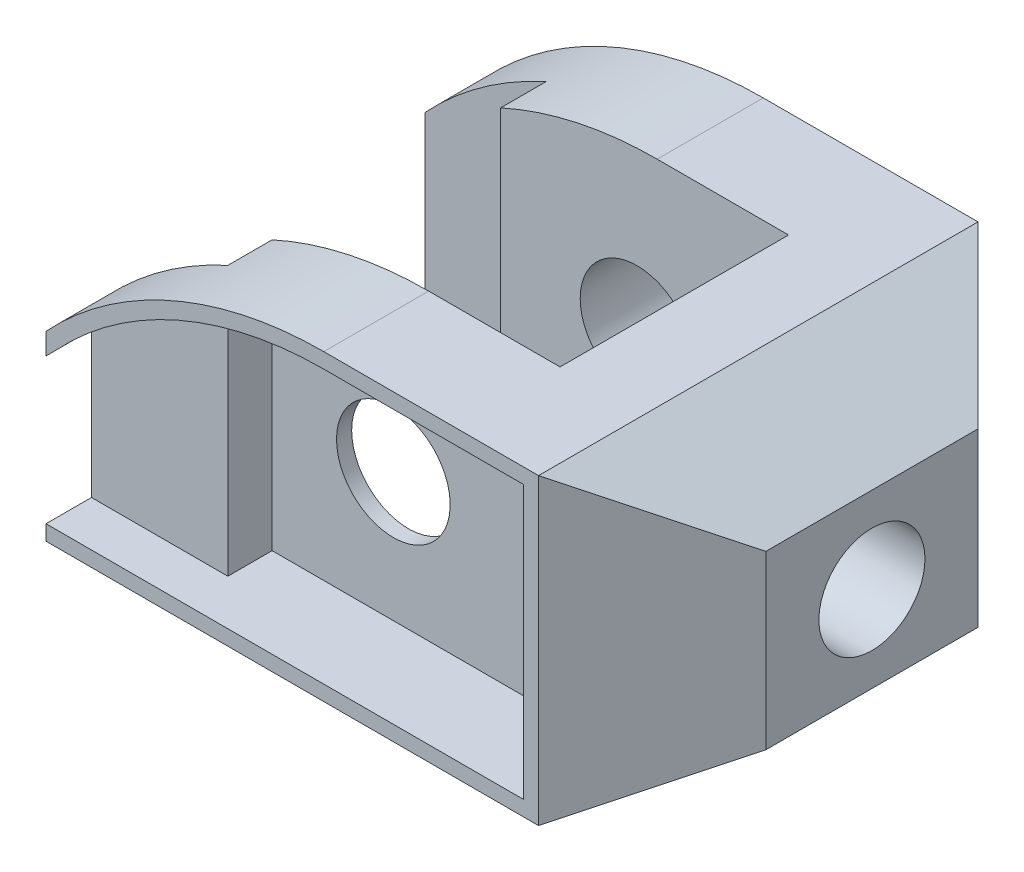
ISO-10303-21;
HEADER;
FILE_DESCRIPTION(('STEP AP214'),'2;1');
FILE_NAME('part.step','',(''),(''),'','','');
FILE_SCHEMA(('AUTOMOTIVE_DESIGN { 1 0 10303 214 1 1 1 1 }'));
ENDSEC;
DATA;
#1=APPLICATION_CONTEXT('core data for automotive mechanical design processes');
#2=APPLICATION_PROTOCOL_DEFINITION('international standard','automotive_design',2000,#1);
#3=PRODUCT_CONTEXT('',#1,'mechanical');
#4=PRODUCT('Part','Part','',(#3));
#5=PRODUCT_RELATED_PRODUCT_CATEGORY('part','',(#4));
#6=PRODUCT_DEFINITION_FORMATION('','',#4);
#7=PRODUCT_DEFINITION_CONTEXT('part definition',#1,'design');
#8=PRODUCT_DEFINITION('design','',#6,#7);
#9=PRODUCT_DEFINITION_SHAPE('','',#8);
#10=(LENGTH_UNIT() NAMED_UNIT(*) SI_UNIT(.MILLI.,.METRE.));
#11=(NAMED_UNIT(*) PLANE_ANGLE_UNIT() SI_UNIT($,.RADIAN.));
#12=(NAMED_UNIT(*) SI_UNIT($,.STERADIAN.) SOLID_ANGLE_UNIT());
#13=UNCERTAINTY_MEASURE_WITH_UNIT(LENGTH_MEASURE(1.E-05),#10,'distance_accuracy_value','');
#14=(GEOMETRIC_REPRESENTATION_CONTEXT(3) GLOBAL_UNCERTAINTY_ASSIGNED_CONTEXT((#13)) GLOBAL_UNIT_ASSIGNED_CONTEXT((#10,
#11,#12)) REPRESENTATION_CONTEXT('',''));
#15=CARTESIAN_POINT('',(0.,0.,0.));
#16=DIRECTION('',(0.,0.,1.));
#17=DIRECTION('',(1.,0.,0.));
#18=AXIS2_PLACEMENT_3D('',#15,#16,#17);
#19=CARTESIAN_POINT('',(34.,19.,58.));
#20=DIRECTION('',(0.,0.,-1.));
#21=DIRECTION('',(-1.,0.,0.));
#22=AXIS2_PLACEMENT_3D('',#19,#20,#21);
#23=CYLINDRICAL_SURFACE('',#22,7.5);
#24=CARTESIAN_POINT('',(34.,19.,44.1598243638916));
#25=DIRECTION('',(0.,0.,1.));
#26=DIRECTION('',(1.,0.,0.));
#27=AXIS2_PLACEMENT_3D('',#24,#25,#26);
#28=CIRCLE('',#27,7.5);
#29=CARTESIAN_POINT('',(26.5,19.,44.1598243638916));
#30=VERTEX_POINT('',#29);
#31=EDGE_CURVE('E318',#30,#30,#28,.T.);
#32=CARTESIAN_POINT('',(34.,19.,46.1598243638916));
#33=DIRECTION('',(0.,0.,1.));
#34=DIRECTION('',(1.,0.,0.));
#35=AXIS2_PLACEMENT_3D('',#32,#33,#34);
#36=CIRCLE('',#35,7.5);
#37=CARTESIAN_POINT('',(26.5,19.,46.1598243638916));
#38=VERTEX_POINT('',#37);
#39=EDGE_CURVE('E50',#38,#38,#36,.T.);
#40=CARTESIAN_POINT('',(26.5,19.,44.1598243638916));
#41=CARTESIAN_POINT('',(26.5,19.,44.180657697225));
#42=CARTESIAN_POINT('',(26.5,19.,44.2014910305583));
#43=CARTESIAN_POINT('',(26.5,19.,44.243157697225));
#44=CARTESIAN_POINT('',(26.5,19.,44.2639910305583));
#45=CARTESIAN_POINT('',(26.5,19.,44.305657697225));
#46=CARTESIAN_POINT('',(26.5,19.,44.3264910305583));
#47=CARTESIAN_POINT('',(26.5,19.,44.368157697225));
#48=CARTESIAN_POINT('',(26.5,19.,44.3889910305583));
#49=CARTESIAN_POINT('',(26.5,19.,44.430657697225));
#50=CARTESIAN_POINT('',(26.5,19.,44.4514910305583));
#51=CARTESIAN_POINT('',(26.5,19.,44.493157697225));
#52=CARTESIAN_POINT('',(26.5,19.,44.5139910305583));
#53=CARTESIAN_POINT('',(26.5,19.,44.555657697225));
#54=CARTESIAN_POINT('',(26.5,19.,44.5764910305583));
#55=CARTESIAN_POINT('',(26.5,19.,44.618157697225));
#56=CARTESIAN_POINT('',(26.5,19.,44.6389910305583));
#57=CARTESIAN_POINT('',(26.5,19.,44.680657697225));
#58=CARTESIAN_POINT('',(26.5,19.,44.7014910305583));
#59=CARTESIAN_POINT('',(26.5,19.,44.743157697225));
#60=CARTESIAN_POINT('',(26.5,19.,44.7639910305583));
#61=CARTESIAN_POINT('',(26.5,19.,44.805657697225));
#62=CARTESIAN_POINT('',(26.5,19.,44.8264910305583));
#63=CARTESIAN_POINT('',(26.5,19.,44.868157697225));
#64=CARTESIAN_POINT('',(26.5,19.,44.8889910305583));
#65=CARTESIAN_POINT('',(26.5,19.,44.930657697225));
#66=CARTESIAN_POINT('',(26.5,19.,44.9514910305583));
#67=CARTESIAN_POINT('',(26.5,19.,44.993157697225));
#68=CARTESIAN_POINT('',(26.5,19.,45.0139910305583));
#69=CARTESIAN_POINT('',(26.5,19.,45.055657697225));
#70=CARTESIAN_POINT('',(26.5,19.,45.0764910305583));
#71=CARTESIAN_POINT('',(26.5,19.,45.118157697225));
#72=CARTESIAN_POINT('',(26.5,19.,45.1389910305583));
#73=CARTESIAN_POINT('',(26.5,19.,45.180657697225));
#74=CARTESIAN_POINT('',(26.5,19.,45.2014910305583));
#75=CARTESIAN_POINT('',(26.5,19.,45.243157697225));
#76=CARTESIAN_POINT('',(26.5,19.,45.2639910305583));
#77=CARTESIAN_POINT('',(26.5,19.,45.305657697225));
#78=CARTESIAN_POINT('',(26.5,19.,45.3264910305583));
#79=CARTESIAN_POINT('',(26.5,19.,45.368157697225));
#80=CARTESIAN_POINT('',(26.5,19.,45.3889910305583));
#81=CARTESIAN_POINT('',(26.5,19.,45.430657697225));
#82=CARTESIAN_POINT('',(26.5,19.,45.4514910305583));
#83=CARTESIAN_POINT('',(26.5,19.,45.493157697225));
#84=CARTESIAN_POINT('',(26.5,19.,45.5139910305583));
#85=CARTESIAN_POINT('',(26.5,19.,45.555657697225));
#86=CARTESIAN_POINT('',(26.5,19.,45.5764910305583));
#87=CARTESIAN_POINT('',(26.5,19.,45.618157697225));
#88=CARTESIAN_POINT('',(26.5,19.,45.6389910305583));
#89=CARTESIAN_POINT('',(26.5,19.,45.680657697225));
#90=CARTESIAN_POINT('',(26.5,19.,45.7014910305583));
#91=CARTESIAN_POINT('',(26.5,19.,45.743157697225));
#92=CARTESIAN_POINT('',(26.5,19.,45.7639910305583));
#93=CARTESIAN_POINT('',(26.5,19.,45.805657697225));
#94=CARTESIAN_POINT('',(26.5,19.,45.8264910305583));
#95=CARTESIAN_POINT('',(26.5,19.,45.868157697225));
#96=CARTESIAN_POINT('',(26.5,19.,45.8889910305583));
#97=CARTESIAN_POINT('',(26.5,19.,45.930657697225));
#98=CARTESIAN_POINT('',(26.5,19.,45.9514910305583));
#99=CARTESIAN_POINT('',(26.5,19.,45.993157697225));
#100=CARTESIAN_POINT('',(26.5,19.,46.0139910305583));
#101=CARTESIAN_POINT('',(26.5,19.,46.055657697225));
#102=CARTESIAN_POINT('',(26.5,19.,46.0764910305583));
#103=CARTESIAN_POINT('',(26.5,19.,46.118157697225));
#104=CARTESIAN_POINT('',(26.5,19.,46.1389910305583));
#105=CARTESIAN_POINT('',(26.5,19.,46.1598243638916));
#106=B_SPLINE_CURVE_WITH_KNOTS('',3,(#40,#41,#42,#43,#44,#45,#46,#47,#48,#49,#50,#51,#52,#53,
#54,#55,#56,#57,#58,#59,#60,#61,#62,#63,#64,#65,#66,#67,#68,#69,#70,#71,#72,#73,#74,#75,#76,#77,
#78,#79,#80,#81,#82,#83,#84,#85,#86,#87,#88,#89,#90,#91,#92,#93,#94,#95,#96,#97,#98,#99,#100,
#101,#102,#103,#104,#105),.UNSPECIFIED.,.F.,.F.,(4,2,2,2,2,2,2,2,2,2,2,2,2,2,2,2,2,2,2,2,2,2,2,
2,2,2,2,2,2,2,2,2,4),(0.,0.0625000000000001,0.125,0.1875,0.25,0.3125,0.375,0.4375,0.5,0.5625,
0.625000000000001,0.687500000000001,0.750000000000001,0.812500000000001,0.875000000000001,
0.937500000000001,1.,1.0625,1.125,1.1875,1.25,1.3125,1.375,1.4375,1.5,1.5625,1.625,1.6875,1.75,
1.8125,1.875,1.9375,2.),.UNSPECIFIED.);
#107=EDGE_CURVE('BSEAM46',#30,#38,#106,.T.);
#108=ORIENTED_EDGE('',*,*,#31,.F.);
#109=ORIENTED_EDGE('',*,*,#39,.T.);
#110=ORIENTED_EDGE('',*,*,#107,.T.);
#111=ORIENTED_EDGE('',*,*,#107,.F.);
#112=EDGE_LOOP('',(#108,#110,#109,#111));
#113=FACE_BOUND('',#112,.T.);
#114=ADVANCED_FACE('F46',(#113),#23,.F.);
#115=CARTESIAN_POINT('',(16.,40.,52.));
#116=DIRECTION('',(0.,0.,1.));
#117=DIRECTION('',(1.,0.,0.));
#118=AXIS2_PLACEMENT_3D('',#115,#116,#117);
#119=PLANE('',#118);
#120=DIRECTION('',(-1.,0.,0.));
#121=VECTOR('',#120,1.);
#122=CARTESIAN_POINT('',(0.,2.,52.));
#123=LINE('',#122,#121);
#124=CARTESIAN_POINT('',(18.,1.99999999999999,52.));
#125=VERTEX_POINT('',#124);
#126=CARTESIAN_POINT('',(0.,2.,52.));
#127=VERTEX_POINT('',#126);
#128=EDGE_CURVE('E241',#125,#127,#123,.T.);
#129=ORIENTED_EDGE('',*,*,#128,.F.);
#130=DIRECTION('',(0.,1.,0.));
#131=VECTOR('',#130,1.);
#132=CARTESIAN_POINT('',(18.,1.99999999999999,52.));
#133=LINE('',#132,#131);
#134=CARTESIAN_POINT('',(18.,34.2241995242987,52.));
#135=VERTEX_POINT('',#134);
#136=EDGE_CURVE('E225',#125,#135,#133,.T.);
#137=ORIENTED_EDGE('',*,*,#136,.T.);
#138=CARTESIAN_POINT('',(36.6606585209371,-10.,52.));
#139=DIRECTION('',(0.,0.,1.));
#140=DIRECTION('',(1.,0.,0.));
#141=AXIS2_PLACEMENT_3D('',#138,#139,#140);
#142=CIRCLE('',#141,48.);
#143=CARTESIAN_POINT('',(1.50716033056821,22.683811971368,52.));
#144=VERTEX_POINT('',#143);
#145=EDGE_CURVE('E239',#144,#135,#142,.F.);
#146=ORIENTED_EDGE('',*,*,#145,.F.);
#147=DIRECTION('',(0.707106781186542,0.707106781186553,0.));
#148=VECTOR('',#147,1.);
#149=CARTESIAN_POINT('',(-10.5883258203999,10.5883258203997,52.));
#150=LINE('',#149,#148);
#151=CARTESIAN_POINT('',(0.,21.1766516407997,52.));
#152=VERTEX_POINT('',#151);
#153=EDGE_CURVE('E250',#152,#144,#150,.T.);
#154=ORIENTED_EDGE('',*,*,#153,.F.);
#155=DIRECTION('',(0.,1.,0.));
#156=VECTOR('',#155,1.);
#157=CARTESIAN_POINT('',(0.,0.,52.));
#158=LINE('',#157,#156);
#159=EDGE_CURVE('E256',#127,#152,#158,.T.);
#160=ORIENTED_EDGE('',*,*,#159,.F.);
#161=EDGE_LOOP('',(#129,#137,#146,#154,#160));
#162=FACE_BOUND('',#161,.T.);
#163=ADVANCED_FACE('F238',(#162),#119,.T.);
#164=CARTESIAN_POINT('',(36.6606585209371,-10.,58.));
#165=DIRECTION('',(0.,0.,-1.));
#166=DIRECTION('',(-1.,0.,0.));
#167=AXIS2_PLACEMENT_3D('',#164,#165,#166);
#168=CYLINDRICAL_SURFACE('',#167,50.);
#169=DIRECTION('',(0.,0.,-1.));
#170=VECTOR('',#169,1.);
#171=CARTESIAN_POINT('',(36.6606585209371,40.,58.));
#172=LINE('',#171,#170);
#173=CARTESIAN_POINT('',(36.6606585209371,40.,58.));
#174=VERTEX_POINT('',#173);
#175=CARTESIAN_POINT('',(36.6606585209371,40.,44.1598243638916));
#176=VERTEX_POINT('',#175);
#177=EDGE_CURVE('E457',#174,#176,#172,.T.);
#178=ORIENTED_EDGE('',*,*,#177,.T.);
#179=CARTESIAN_POINT('',(36.6606585209371,-10.,44.1598243638916));
#180=DIRECTION('',(0.,0.,1.));
#181=DIRECTION('',(1.,0.,0.));
#182=AXIS2_PLACEMENT_3D('',#179,#180,#181);
#183=CIRCLE('',#182,50.);
#184=CARTESIAN_POINT('',(16.,35.5317163028282,44.1598243638916));
#185=VERTEX_POINT('',#184);
#186=EDGE_CURVE('E322',#176,#185,#183,.T.);
#187=ORIENTED_EDGE('',*,*,#186,.T.);
#188=DIRECTION('',(0.,0.,-1.));
#189=VECTOR('',#188,1.);
#190=CARTESIAN_POINT('',(16.,35.5317163028282,58.));
#191=LINE('',#190,#189);
#192=CARTESIAN_POINT('',(16.,35.5317163028282,50.));
#193=VERTEX_POINT('',#192);
#194=EDGE_CURVE('E350',#185,#193,#191,.F.);
#195=ORIENTED_EDGE('',*,*,#194,.T.);
#196=CARTESIAN_POINT('',(36.6606585209371,-10.,50.));
#197=DIRECTION('',(0.,0.,1.));
#198=DIRECTION('',(1.,0.,0.));
#199=AXIS2_PLACEMENT_3D('',#196,#197,#198);
#200=CIRCLE('',#199,50.);
#201=CARTESIAN_POINT('',(0.0424312393028439,24.045637470175,50.));
#202=VERTEX_POINT('',#201);
#203=EDGE_CURVE('E357',#193,#202,#200,.T.);
#204=ORIENTED_EDGE('',*,*,#203,.T.);
#205=DIRECTION('',(0.,0.,-1.));
#206=VECTOR('',#205,1.);
#207=CARTESIAN_POINT('',(0.04243123930283,24.045637470175,58.));
#208=LINE('',#207,#206);
#209=CARTESIAN_POINT('',(0.04243123930283,24.045637470175,58.));
#210=VERTEX_POINT('',#209);
#211=EDGE_CURVE('E452',#210,#202,#208,.T.);
#212=ORIENTED_EDGE('',*,*,#211,.F.);
#213=CARTESIAN_POINT('',(36.6606585209371,-10.,58.));
#214=DIRECTION('',(0.,0.,1.));
#215=DIRECTION('',(1.,0.,0.));
#216=AXIS2_PLACEMENT_3D('',#213,#214,#215);
#217=CIRCLE('',#216,50.);
#218=EDGE_CURVE('E412',#174,#210,#217,.T.);
#219=ORIENTED_EDGE('',*,*,#218,.F.);
#220=EDGE_LOOP('',(#178,#187,#195,#204,#212,#219));
#221=FACE_BOUND('',#220,.T.);
#222=ADVANCED_FACE('F492',(#221),#168,.T.);
#223=CARTESIAN_POINT('',(0.,20.,29.));
#224=DIRECTION('',(1.,0.,0.));
#225=DIRECTION('',(0.,0.,-1.));
#226=AXIS2_PLACEMENT_3D('',#223,#224,#225);
#227=CYLINDRICAL_SURFACE('',#226,7.);
#228=CARTESIAN_POINT('',(80.,20.,29.));
#229=DIRECTION('',(1.,0.,0.));
#230=DIRECTION('',(0.,0.,-1.));
#231=AXIS2_PLACEMENT_3D('',#228,#229,#230);
#232=CIRCLE('',#231,7.);
#233=CARTESIAN_POINT('',(80.,20.,22.));
#234=VERTEX_POINT('',#233);
#235=EDGE_CURVE('E373',#234,#234,#232,.T.);
#236=ORIENTED_EDGE('',*,*,#235,.T.);
#237=EDGE_LOOP('',(#236));
#238=FACE_BOUND('',#237,.T.);
#239=CARTESIAN_POINT('',(54.,20.,29.));
#240=DIRECTION('',(-1.,0.,0.));
#241=DIRECTION('',(0.,0.,1.));
#242=AXIS2_PLACEMENT_3D('',#239,#240,#241);
#243=CIRCLE('',#242,7.);
#244=CARTESIAN_POINT('',(54.,20.,36.));
#245=VERTEX_POINT('',#244);
#246=EDGE_CURVE('E326',#245,#245,#243,.F.);
#247=ORIENTED_EDGE('',*,*,#246,.F.);
#248=EDGE_LOOP('',(#247));
#249=FACE_BOUND('',#248,.T.);
#250=ADVANCED_FACE('F489',(#238,#249),#227,.F.);
#251=CARTESIAN_POINT('',(16.,0.,0.));
#252=DIRECTION('',(1.,0.,0.));
#253=DIRECTION('',(0.,0.,-1.));
#254=AXIS2_PLACEMENT_3D('',#251,#252,#253);
#255=PLANE('',#254);
#256=ORIENTED_EDGE('',*,*,#194,.F.);
#257=DIRECTION('',(0.,1.,0.));
#258=VECTOR('',#257,1.);
#259=CARTESIAN_POINT('',(16.,0.,44.1598243638916));
#260=LINE('',#259,#258);
#261=CARTESIAN_POINT('',(16.,0.,44.1598243638916));
#262=VERTEX_POINT('',#261);
#263=EDGE_CURVE('E249',#262,#185,#260,.T.);
#264=ORIENTED_EDGE('',*,*,#263,.F.);
#265=DIRECTION('',(0.,0.,1.));
#266=VECTOR('',#265,1.);
#267=CARTESIAN_POINT('',(16.,0.,50.));
#268=LINE('',#267,#266);
#269=CARTESIAN_POINT('',(16.,0.,50.));
#270=VERTEX_POINT('',#269);
#271=EDGE_CURVE('E332',#262,#270,#268,.T.);
#272=ORIENTED_EDGE('',*,*,#271,.T.);
#273=DIRECTION('',(0.,1.,0.));
#274=VECTOR('',#273,1.);
#275=CARTESIAN_POINT('',(16.,40.,50.));
#276=LINE('',#275,#274);
#277=EDGE_CURVE('E331',#270,#193,#276,.T.);
#278=ORIENTED_EDGE('',*,*,#277,.T.);
#279=EDGE_LOOP('',(#256,#264,#272,#278));
#280=FACE_BOUND('',#279,.T.);
#281=ADVANCED_FACE('F491',(#280),#255,.F.);
#282=CARTESIAN_POINT('',(0.,0.,58.));
#283=DIRECTION('',(1.,0.,0.));
#284=DIRECTION('',(0.,0.,-1.));
#285=AXIS2_PLACEMENT_3D('',#282,#283,#284);
#286=PLANE('',#285);
#287=DIRECTION('',(0.,0.,-1.));
#288=VECTOR('',#287,1.);
#289=CARTESIAN_POINT('',(0.,0.,58.));
#290=LINE('',#289,#288);
#291=CARTESIAN_POINT('',(0.,0.,8.));
#292=VERTEX_POINT('',#291);
#293=CARTESIAN_POINT('',(0.,0.,0.));
#294=VERTEX_POINT('',#293);
#295=EDGE_CURVE('E423',#292,#294,#290,.T.);
#296=ORIENTED_EDGE('',*,*,#295,.F.);
#297=DIRECTION('',(0.,-1.,0.));
#298=VECTOR('',#297,1.);
#299=CARTESIAN_POINT('',(0.,0.,8.));
#300=LINE('',#299,#298);
#301=CARTESIAN_POINT('',(0.,24.,8.));
#302=VERTEX_POINT('',#301);
#303=EDGE_CURVE('E343',#302,#292,#300,.T.);
#304=ORIENTED_EDGE('',*,*,#303,.F.);
#305=DIRECTION('',(0.,0.,-1.));
#306=VECTOR('',#305,1.);
#307=CARTESIAN_POINT('',(0.,24.,58.));
#308=LINE('',#307,#306);
#309=CARTESIAN_POINT('',(0.,24.,0.));
#310=VERTEX_POINT('',#309);
#311=EDGE_CURVE('E446',#302,#310,#308,.T.);
#312=ORIENTED_EDGE('',*,*,#311,.T.);
#313=DIRECTION('',(0.,-1.,0.));
#314=VECTOR('',#313,1.);
#315=CARTESIAN_POINT('',(0.,0.,0.));
#316=LINE('',#315,#314);
#317=EDGE_CURVE('E409',#310,#294,#316,.T.);
#318=ORIENTED_EDGE('',*,*,#317,.T.);
#319=EDGE_LOOP('',(#296,#304,#312,#318));
#320=FACE_BOUND('',#319,.T.);
#321=ADVANCED_FACE('F499',(#320),#286,.F.);
#322=CARTESIAN_POINT('',(0.,24.,58.));
#323=DIRECTION('',(0.73236454563287,-0.680912749403299,0.));
#324=DIRECTION('',(0.680912749403299,0.73236454563287,0.));
#325=AXIS2_PLACEMENT_3D('',#322,#323,#324);
#326=PLANE('',#325);
#327=ORIENTED_EDGE('',*,*,#211,.T.);
#328=DIRECTION('',(-0.680912749403299,-0.73236454563287,0.));
#329=VECTOR('',#328,1.);
#330=CARTESIAN_POINT('',(0.,24.,50.));
#331=LINE('',#330,#329);
#332=CARTESIAN_POINT('',(0.,24.,50.));
#333=VERTEX_POINT('',#332);
#334=EDGE_CURVE('E361',#202,#333,#331,.T.);
#335=ORIENTED_EDGE('',*,*,#334,.T.);
#336=CARTESIAN_POINT('',(0.,24.,58.));
#337=VERTEX_POINT('',#336);
#338=EDGE_CURVE('E447',#337,#333,#308,.T.);
#339=ORIENTED_EDGE('',*,*,#338,.F.);
#340=DIRECTION('',(-0.680912749403299,-0.73236454563287,0.));
#341=VECTOR('',#340,1.);
#342=CARTESIAN_POINT('',(0.,24.,58.));
#343=LINE('',#342,#341);
#344=EDGE_CURVE('E415',#210,#337,#343,.T.);
#345=ORIENTED_EDGE('',*,*,#344,.F.);
#346=EDGE_LOOP('',(#327,#335,#339,#345));
#347=FACE_BOUND('',#346,.T.);
#348=ADVANCED_FACE('F552',(#347),#326,.F.);
#349=CARTESIAN_POINT('',(36.6606585209371,-10.,58.));
#350=DIRECTION('',(0.,0.,1.));
#351=DIRECTION('',(1.,0.,0.));
#352=AXIS2_PLACEMENT_3D('',#349,#350,#351);
#353=PLANE('',#352);
#354=DIRECTION('',(1.,0.,0.));
#355=VECTOR('',#354,1.);
#356=CARTESIAN_POINT('',(0.,2.,58.));
#357=LINE('',#356,#355);
#358=CARTESIAN_POINT('',(0.,2.,58.));
#359=VERTEX_POINT('',#358);
#360=CARTESIAN_POINT('',(63.,2.,58.));
#361=VERTEX_POINT('',#360);
#362=EDGE_CURVE('E281',#359,#361,#357,.T.);
#363=ORIENTED_EDGE('',*,*,#362,.F.);
#364=DIRECTION('',(0.,-1.,0.));
#365=VECTOR('',#364,1.);
#366=CARTESIAN_POINT('',(0.,0.,58.));
#367=LINE('',#366,#365);
#368=CARTESIAN_POINT('',(0.,0.,58.));
#369=VERTEX_POINT('',#368);
#370=EDGE_CURVE('E418',#359,#369,#367,.T.);
#371=ORIENTED_EDGE('',*,*,#370,.T.);
#372=DIRECTION('',(1.,0.,0.));
#373=VECTOR('',#372,1.);
#374=CARTESIAN_POINT('',(65.,0.,58.));
#375=LINE('',#374,#373);
#376=CARTESIAN_POINT('',(65.,0.,58.));
#377=VERTEX_POINT('',#376);
#378=EDGE_CURVE('E404',#369,#377,#375,.T.);
#379=ORIENTED_EDGE('',*,*,#378,.T.);
#380=DIRECTION('',(0.,-1.,0.));
#381=VECTOR('',#380,1.);
#382=CARTESIAN_POINT('',(65.,40.,58.));
#383=LINE('',#382,#381);
#384=CARTESIAN_POINT('',(65.,40.,58.));
#385=VERTEX_POINT('',#384);
#386=EDGE_CURVE('E383',#385,#377,#383,.T.);
#387=ORIENTED_EDGE('',*,*,#386,.F.);
#388=DIRECTION('',(-1.,0.,0.));
#389=VECTOR('',#388,1.);
#390=CARTESIAN_POINT('',(65.,40.,58.));
#391=LINE('',#390,#389);
#392=EDGE_CURVE('E408',#385,#174,#391,.T.);
#393=ORIENTED_EDGE('',*,*,#392,.T.);
#394=ORIENTED_EDGE('',*,*,#218,.T.);
#395=ORIENTED_EDGE('',*,*,#344,.T.);
#396=CARTESIAN_POINT('',(0.,21.1766516407997,58.));
#397=VERTEX_POINT('',#396);
#398=EDGE_CURVE('E419',#337,#397,#367,.T.);
#399=ORIENTED_EDGE('',*,*,#398,.T.);
#400=DIRECTION('',(-0.707106781186542,-0.707106781186553,0.));
#401=VECTOR('',#400,1.);
#402=CARTESIAN_POINT('',(-10.5883258203999,10.5883258203997,58.));
#403=LINE('',#402,#401);
#404=CARTESIAN_POINT('',(1.50716033056821,22.683811971368,58.));
#405=VERTEX_POINT('',#404);
#406=EDGE_CURVE('E901',#405,#397,#403,.T.);
#407=ORIENTED_EDGE('',*,*,#406,.F.);
#408=CARTESIAN_POINT('',(36.6606585209371,-10.,58.));
#409=DIRECTION('',(0.,0.,1.));
#410=DIRECTION('',(1.,0.,0.));
#411=AXIS2_PLACEMENT_3D('',#408,#409,#410);
#412=CIRCLE('',#411,48.);
#413=CARTESIAN_POINT('',(36.6606585209371,38.,58.));
#414=VERTEX_POINT('',#413);
#415=EDGE_CURVE('E903',#414,#405,#412,.T.);
#416=ORIENTED_EDGE('',*,*,#415,.F.);
#417=DIRECTION('',(-1.,0.,0.));
#418=VECTOR('',#417,1.);
#419=CARTESIAN_POINT('',(0.,38.,58.));
#420=LINE('',#419,#418);
#421=CARTESIAN_POINT('',(63.,38.,58.));
#422=VERTEX_POINT('',#421);
#423=EDGE_CURVE('E260',#422,#414,#420,.T.);
#424=ORIENTED_EDGE('',*,*,#423,.F.);
#425=DIRECTION('',(0.,-1.,0.));
#426=VECTOR('',#425,1.);
#427=CARTESIAN_POINT('',(63.,0.,58.));
#428=LINE('',#427,#426);
#429=EDGE_CURVE('E265',#422,#361,#428,.T.);
#430=ORIENTED_EDGE('',*,*,#429,.T.);
#431=EDGE_LOOP('',(#363,#371,#379,#387,#393,#394,#395,#399,#407,#416,#424,#430));
#432=FACE_BOUND('',#431,.T.);
#433=ADVANCED_FACE('F542',(#432),#353,.T.);
#434=CARTESIAN_POINT('',(36.6606585209371,-10.,0.));
#435=DIRECTION('',(0.,0.,1.));
#436=DIRECTION('',(1.,0.,0.));
#437=AXIS2_PLACEMENT_3D('',#434,#435,#436);
#438=PLANE('',#437);
#439=DIRECTION('',(-1.,0.,0.));
#440=VECTOR('',#439,1.);
#441=CARTESIAN_POINT('',(65.,40.,0.));
#442=LINE('',#441,#440);
#443=CARTESIAN_POINT('',(65.,40.,0.));
#444=VERTEX_POINT('',#443);
#445=CARTESIAN_POINT('',(36.6606585209371,40.,0.));
#446=VERTEX_POINT('',#445);
#447=EDGE_CURVE('E427',#444,#446,#442,.T.);
#448=ORIENTED_EDGE('',*,*,#447,.F.);
#449=DIRECTION('',(0.,-1.,0.));
#450=VECTOR('',#449,1.);
#451=CARTESIAN_POINT('',(65.,40.,0.));
#452=LINE('',#451,#450);
#453=CARTESIAN_POINT('',(65.,0.,0.));
#454=VERTEX_POINT('',#453);
#455=EDGE_CURVE('E386',#444,#454,#452,.T.);
#456=ORIENTED_EDGE('',*,*,#455,.T.);
#457=DIRECTION('',(1.,0.,0.));
#458=VECTOR('',#457,1.);
#459=CARTESIAN_POINT('',(65.,0.,0.));
#460=LINE('',#459,#458);
#461=EDGE_CURVE('E403',#294,#454,#460,.T.);
#462=ORIENTED_EDGE('',*,*,#461,.F.);
#463=ORIENTED_EDGE('',*,*,#317,.F.);
#464=DIRECTION('',(-0.680912749403299,-0.73236454563287,0.));
#465=VECTOR('',#464,1.);
#466=CARTESIAN_POINT('',(0.,24.,0.));
#467=LINE('',#466,#465);
#468=CARTESIAN_POINT('',(0.04243123930283,24.045637470175,0.));
#469=VERTEX_POINT('',#468);
#470=EDGE_CURVE('E435',#469,#310,#467,.T.);
#471=ORIENTED_EDGE('',*,*,#470,.F.);
#472=CARTESIAN_POINT('',(36.6606585209371,-10.,0.));
#473=DIRECTION('',(0.,0.,1.));
#474=DIRECTION('',(1.,0.,0.));
#475=AXIS2_PLACEMENT_3D('',#472,#473,#474);
#476=CIRCLE('',#475,50.);
#477=EDGE_CURVE('E431',#446,#469,#476,.T.);
#478=ORIENTED_EDGE('',*,*,#477,.F.);
#479=EDGE_LOOP('',(#448,#456,#462,#463,#471,#478));
#480=FACE_BOUND('',#479,.T.);
#481=CARTESIAN_POINT('',(34.,19.,0.));
#482=DIRECTION('',(0.,0.,1.));
#483=DIRECTION('',(1.,0.,0.));
#484=AXIS2_PLACEMENT_3D('',#481,#482,#483);
#485=CIRCLE('',#484,7.5);
#486=CARTESIAN_POINT('',(26.5,19.,0.));
#487=VERTEX_POINT('',#486);
#488=EDGE_CURVE('E399',#487,#487,#485,.T.);
#489=ORIENTED_EDGE('',*,*,#488,.T.);
#490=EDGE_LOOP('',(#489));
#491=FACE_BOUND('',#490,.T.);
#492=ADVANCED_FACE('F540',(#480,#491),#438,.F.);
#493=CARTESIAN_POINT('',(65.,0.,58.));
#494=DIRECTION('',(0.,1.,0.));
#495=DIRECTION('',(-1.,0.,0.));
#496=AXIS2_PLACEMENT_3D('',#493,#494,#495);
#497=PLANE('',#496);
#498=ORIENTED_EDGE('',*,*,#271,.F.);
#499=DIRECTION('',(-1.,0.,0.));
#500=VECTOR('',#499,1.);
#501=CARTESIAN_POINT('',(130.096057785626,0.,44.1598243638916));
#502=LINE('',#501,#500);
#503=CARTESIAN_POINT('',(54.,0.,44.1598243638916));
#504=VERTEX_POINT('',#503);
#505=EDGE_CURVE('E301',#504,#262,#502,.T.);
#506=ORIENTED_EDGE('',*,*,#505,.F.);
#507=DIRECTION('',(0.,0.,-1.));
#508=VECTOR('',#507,1.);
#509=CARTESIAN_POINT('',(54.,0.,14.));
#510=LINE('',#509,#508);
#511=CARTESIAN_POINT('',(54.,0.,14.));
#512=VERTEX_POINT('',#511);
#513=EDGE_CURVE('E285',#504,#512,#510,.T.);
#514=ORIENTED_EDGE('',*,*,#513,.T.);
#515=DIRECTION('',(-1.,0.,0.));
#516=VECTOR('',#515,1.);
#517=CARTESIAN_POINT('',(130.096057785626,0.,14.));
#518=LINE('',#517,#516);
#519=CARTESIAN_POINT('',(16.,0.,14.));
#520=VERTEX_POINT('',#519);
#521=EDGE_CURVE('E304',#512,#520,#518,.T.);
#522=ORIENTED_EDGE('',*,*,#521,.T.);
#523=CARTESIAN_POINT('',(16.,0.,8.));
#524=VERTEX_POINT('',#523);
#525=EDGE_CURVE('E327',#524,#520,#268,.T.);
#526=ORIENTED_EDGE('',*,*,#525,.F.);
#527=DIRECTION('',(-1.,0.,0.));
#528=VECTOR('',#527,1.);
#529=CARTESIAN_POINT('',(16.,0.,8.));
#530=LINE('',#529,#528);
#531=EDGE_CURVE('E346',#524,#292,#530,.T.);
#532=ORIENTED_EDGE('',*,*,#531,.T.);
#533=ORIENTED_EDGE('',*,*,#295,.T.);
#534=ORIENTED_EDGE('',*,*,#461,.T.);
#535=DIRECTION('',(0.,0.,-1.));
#536=VECTOR('',#535,1.);
#537=CARTESIAN_POINT('',(65.,0.,58.));
#538=LINE('',#537,#536);
#539=EDGE_CURVE('E473',#377,#454,#538,.T.);
#540=ORIENTED_EDGE('',*,*,#539,.F.);
#541=ORIENTED_EDGE('',*,*,#378,.F.);
#542=CARTESIAN_POINT('',(0.,0.,50.));
#543=VERTEX_POINT('',#542);
#544=EDGE_CURVE('E442',#369,#543,#290,.T.);
#545=ORIENTED_EDGE('',*,*,#544,.T.);
#546=DIRECTION('',(-1.,0.,0.));
#547=VECTOR('',#546,1.);
#548=CARTESIAN_POINT('',(16.,0.,50.));
#549=LINE('',#548,#547);
#550=EDGE_CURVE('E339',#270,#543,#549,.T.);
#551=ORIENTED_EDGE('',*,*,#550,.F.);
#552=EDGE_LOOP('',(#498,#506,#514,#522,#526,#532,#533,#534,#540,#541,#545,#551));
#553=FACE_BOUND('',#552,.T.);
#554=ADVANCED_FACE('F48',(#553),#497,.F.);
#555=CARTESIAN_POINT('',(80.,8.66025403784442,58.));
#556=DIRECTION('',(-0.500000000000002,0.866025403784438,0.));
#557=DIRECTION('',(-0.866025403784438,-0.500000000000002,0.));
#558=AXIS2_PLACEMENT_3D('',#555,#556,#557);
#559=PLANE('',#558);
#560=DIRECTION('',(0.,0.,-1.));
#561=VECTOR('',#560,1.);
#562=CARTESIAN_POINT('',(80.,8.66025403784442,58.));
#563=LINE('',#562,#561);
#564=CARTESIAN_POINT('',(80.,8.66025403784444,42.9999999999999));
#565=VERTEX_POINT('',#564);
#566=CARTESIAN_POINT('',(80.,8.66025403784444,14.9999999999999));
#567=VERTEX_POINT('',#566);
#568=EDGE_CURVE('E469',#565,#567,#563,.T.);
#569=ORIENTED_EDGE('',*,*,#568,.F.);
#570=DIRECTION('',(-0.654653670707976,-0.377964473009228,0.654653670707978));
#571=VECTOR('',#570,1.);
#572=CARTESIAN_POINT('',(73.5714285714286,4.94871659305395,49.4285714285714));
#573=LINE('',#572,#571);
#574=EDGE_CURVE('E395',#565,#377,#573,.T.);
#575=ORIENTED_EDGE('',*,*,#574,.T.);
#576=ORIENTED_EDGE('',*,*,#539,.T.);
#577=DIRECTION('',(0.65465367070798,0.37796447300923,0.654653670707973));
#578=VECTOR('',#577,1.);
#579=CARTESIAN_POINT('',(98.4285714285714,19.2999947129104,33.4285714285711));
#580=LINE('',#579,#578);
#581=EDGE_CURVE('E382',#454,#567,#580,.T.);
#582=ORIENTED_EDGE('',*,*,#581,.T.);
#583=EDGE_LOOP('',(#569,#575,#576,#582));
#584=FACE_BOUND('',#583,.T.);
#585=ADVANCED_FACE('F549',(#584),#559,.F.);
#586=CARTESIAN_POINT('',(80.,31.3397459621557,58.));
#587=DIRECTION('',(-1.,0.,0.));
#588=DIRECTION('',(0.,0.,1.));
#589=AXIS2_PLACEMENT_3D('',#586,#587,#588);
#590=PLANE('',#589);
#591=ORIENTED_EDGE('',*,*,#235,.F.);
#592=EDGE_LOOP('',(#591));
#593=FACE_BOUND('',#592,.T.);
#594=DIRECTION('',(0.,0.,-1.));
#595=VECTOR('',#594,1.);
#596=CARTESIAN_POINT('',(80.,31.3397459621557,58.));
#597=LINE('',#596,#595);
#598=CARTESIAN_POINT('',(80.,31.3397459621557,42.9999999999999));
#599=VERTEX_POINT('',#598);
#600=CARTESIAN_POINT('',(80.,31.3397459621557,14.9999999999999));
#601=VERTEX_POINT('',#600);
#602=EDGE_CURVE('E465',#599,#601,#597,.T.);
#603=ORIENTED_EDGE('',*,*,#602,.F.);
#604=DIRECTION('',(0.,-1.,0.));
#605=VECTOR('',#604,1.);
#606=CARTESIAN_POINT('',(80.,40.,42.9999999999999));
#607=LINE('',#606,#605);
#608=EDGE_CURVE('E378',#599,#565,#607,.T.);
#609=ORIENTED_EDGE('',*,*,#608,.T.);
#610=ORIENTED_EDGE('',*,*,#568,.T.);
#611=DIRECTION('',(0.,-1.,0.));
#612=VECTOR('',#611,1.);
#613=CARTESIAN_POINT('',(80.,40.,14.9999999999999));
#614=LINE('',#613,#612);
#615=EDGE_CURVE('E377',#601,#567,#614,.T.);
#616=ORIENTED_EDGE('',*,*,#615,.F.);
#617=EDGE_LOOP('',(#603,#609,#610,#616));
#618=FACE_BOUND('',#617,.T.);
#619=ADVANCED_FACE('F567',(#593,#618),#590,.F.);
#620=CARTESIAN_POINT('',(65.,40.,58.));
#621=DIRECTION('',(-0.499999999999997,-0.86602540378444,0.));
#622=DIRECTION('',(0.86602540378444,-0.499999999999997,0.));
#623=AXIS2_PLACEMENT_3D('',#620,#621,#622);
#624=PLANE('',#623);
#625=DIRECTION('',(0.,0.,-1.));
#626=VECTOR('',#625,1.);
#627=CARTESIAN_POINT('',(65.,40.,58.));
#628=LINE('',#627,#626);
#629=EDGE_CURVE('E461',#385,#444,#628,.T.);
#630=ORIENTED_EDGE('',*,*,#629,.F.);
#631=DIRECTION('',(0.654653670707977,-0.377964473009224,-0.654653670707979));
#632=VECTOR('',#631,1.);
#633=CARTESIAN_POINT('',(65.,40.,58.));
#634=LINE('',#633,#632);
#635=EDGE_CURVE('E56',#385,#599,#634,.T.);
#636=ORIENTED_EDGE('',*,*,#635,.T.);
#637=ORIENTED_EDGE('',*,*,#602,.T.);
#638=DIRECTION('',(-0.654653670707981,0.377964473009226,-0.654653670707974));
#639=VECTOR('',#638,1.);
#640=CARTESIAN_POINT('',(89.8571428571429,25.6487218801437,24.8571428571426));
#641=LINE('',#640,#639);
#642=EDGE_CURVE('E477',#601,#444,#641,.T.);
#643=ORIENTED_EDGE('',*,*,#642,.T.);
#644=EDGE_LOOP('',(#630,#636,#637,#643));
#645=FACE_BOUND('',#644,.T.);
#646=ADVANCED_FACE('F563',(#645),#624,.F.);
#647=CARTESIAN_POINT('',(65.,40.,58.));
#648=DIRECTION('',(0.,-1.,0.));
#649=DIRECTION('',(0.,0.,-1.));
#650=AXIS2_PLACEMENT_3D('',#647,#648,#649);
#651=PLANE('',#650);
#652=DIRECTION('',(0.,0.,1.));
#653=VECTOR('',#652,1.);
#654=CARTESIAN_POINT('',(54.,40.,44.1598243638916));
#655=LINE('',#654,#653);
#656=CARTESIAN_POINT('',(54.,40.,14.));
#657=VERTEX_POINT('',#656);
#658=CARTESIAN_POINT('',(54.,40.,44.1598243638916));
#659=VERTEX_POINT('',#658);
#660=EDGE_CURVE('E293',#657,#659,#655,.T.);
#661=ORIENTED_EDGE('',*,*,#660,.T.);
#662=DIRECTION('',(-1.,0.,0.));
#663=VECTOR('',#662,1.);
#664=CARTESIAN_POINT('',(130.096057785626,40.,44.1598243638916));
#665=LINE('',#664,#663);
#666=EDGE_CURVE('E290',#659,#176,#665,.T.);
#667=ORIENTED_EDGE('',*,*,#666,.T.);
#668=ORIENTED_EDGE('',*,*,#177,.F.);
#669=ORIENTED_EDGE('',*,*,#392,.F.);
#670=ORIENTED_EDGE('',*,*,#629,.T.);
#671=ORIENTED_EDGE('',*,*,#447,.T.);
#672=CARTESIAN_POINT('',(36.6606585209371,40.,14.));
#673=VERTEX_POINT('',#672);
#674=EDGE_CURVE('E456',#673,#446,#172,.T.);
#675=ORIENTED_EDGE('',*,*,#674,.F.);
#676=DIRECTION('',(-1.,0.,0.));
#677=VECTOR('',#676,1.);
#678=CARTESIAN_POINT('',(130.096057785626,40.,14.));
#679=LINE('',#678,#677);
#680=EDGE_CURVE('E254',#657,#673,#679,.T.);
#681=ORIENTED_EDGE('',*,*,#680,.F.);
#682=EDGE_LOOP('',(#661,#667,#668,#669,#670,#671,#675,#681));
#683=FACE_BOUND('',#682,.T.);
#684=ADVANCED_FACE('F559',(#683),#651,.F.);
#685=CARTESIAN_POINT('',(16.,35.5317163028282,8.));
#686=VERTEX_POINT('',#685);
#687=CARTESIAN_POINT('',(16.,35.5317163028282,14.));
#688=VERTEX_POINT('',#687);
#689=EDGE_CURVE('E353',#686,#688,#191,.F.);
#690=ORIENTED_EDGE('',*,*,#689,.T.);
#691=CARTESIAN_POINT('',(36.6606585209371,-10.,14.));
#692=DIRECTION('',(0.,0.,-1.));
#693=DIRECTION('',(-1.,0.,0.));
#694=AXIS2_PLACEMENT_3D('',#691,#692,#693);
#695=CIRCLE('',#694,50.);
#696=EDGE_CURVE('E72',#688,#673,#695,.T.);
#697=ORIENTED_EDGE('',*,*,#696,.T.);
#698=ORIENTED_EDGE('',*,*,#674,.T.);
#699=ORIENTED_EDGE('',*,*,#477,.T.);
#700=CARTESIAN_POINT('',(0.0424312393028314,24.045637470175,8.));
#701=VERTEX_POINT('',#700);
#702=EDGE_CURVE('E451',#701,#469,#208,.T.);
#703=ORIENTED_EDGE('',*,*,#702,.F.);
#704=CARTESIAN_POINT('',(36.6606585209371,-10.,8.));
#705=DIRECTION('',(0.,0.,-1.));
#706=DIRECTION('',(-1.,0.,0.));
#707=AXIS2_PLACEMENT_3D('',#704,#705,#706);
#708=CIRCLE('',#707,50.);
#709=EDGE_CURVE('E369',#701,#686,#708,.T.);
#710=ORIENTED_EDGE('',*,*,#709,.T.);
#711=EDGE_LOOP('',(#690,#697,#698,#699,#703,#710));
#712=FACE_BOUND('',#711,.T.);
#713=ADVANCED_FACE('F505',(#712),#168,.T.);
#714=ORIENTED_EDGE('',*,*,#311,.F.);
#715=DIRECTION('',(0.680912749403299,0.73236454563287,0.));
#716=VECTOR('',#715,1.);
#717=CARTESIAN_POINT('',(0.,24.,8.));
#718=LINE('',#717,#716);
#719=EDGE_CURVE('E365',#302,#701,#718,.T.);
#720=ORIENTED_EDGE('',*,*,#719,.T.);
#721=ORIENTED_EDGE('',*,*,#702,.T.);
#722=ORIENTED_EDGE('',*,*,#470,.T.);
#723=EDGE_LOOP('',(#714,#720,#721,#722));
#724=FACE_BOUND('',#723,.T.);
#725=ADVANCED_FACE('F533',(#724),#326,.F.);
#726=ORIENTED_EDGE('',*,*,#370,.F.);
#727=DIRECTION('',(0.,0.,1.));
#728=VECTOR('',#727,1.);
#729=CARTESIAN_POINT('',(0.,2.,-22.560319734687));
#730=LINE('',#729,#728);
#731=EDGE_CURVE('E270',#127,#359,#730,.T.);
#732=ORIENTED_EDGE('',*,*,#731,.F.);
#733=ORIENTED_EDGE('',*,*,#159,.T.);
#734=DIRECTION('',(0.,0.,1.));
#735=VECTOR('',#734,1.);
#736=CARTESIAN_POINT('',(0.,21.1766516407997,-22.560319734687));
#737=LINE('',#736,#735);
#738=EDGE_CURVE('E64',#152,#397,#737,.T.);
#739=ORIENTED_EDGE('',*,*,#738,.T.);
#740=ORIENTED_EDGE('',*,*,#398,.F.);
#741=ORIENTED_EDGE('',*,*,#338,.T.);
#742=DIRECTION('',(0.,1.,0.));
#743=VECTOR('',#742,1.);
#744=CARTESIAN_POINT('',(0.,40.,50.));
#745=LINE('',#744,#743);
#746=EDGE_CURVE('E340',#543,#333,#745,.T.);
#747=ORIENTED_EDGE('',*,*,#746,.F.);
#748=ORIENTED_EDGE('',*,*,#544,.F.);
#749=EDGE_LOOP('',(#726,#732,#733,#739,#740,#741,#747,#748));
#750=FACE_BOUND('',#749,.T.);
#751=ADVANCED_FACE('F523',(#750),#286,.F.);
#752=CARTESIAN_POINT('',(34.,19.,14.));
#753=DIRECTION('',(0.,0.,-1.));
#754=DIRECTION('',(-1.,0.,0.));
#755=AXIS2_PLACEMENT_3D('',#752,#753,#754);
#756=CIRCLE('',#755,7.5);
#757=CARTESIAN_POINT('',(26.5,19.,14.));
#758=VERTEX_POINT('',#757);
#759=EDGE_CURVE('E312',#758,#758,#756,.T.);
#760=CARTESIAN_POINT('',(26.5,19.,14.));
#761=CARTESIAN_POINT('',(26.5,19.,13.8541666666667));
#762=CARTESIAN_POINT('',(26.5,19.,13.7083333333333));
#763=CARTESIAN_POINT('',(26.5,19.,13.4166666666667));
#764=CARTESIAN_POINT('',(26.5,19.,13.2708333333333));
#765=CARTESIAN_POINT('',(26.5,19.,12.9791666666667));
#766=CARTESIAN_POINT('',(26.5,19.,12.8333333333333));
#767=CARTESIAN_POINT('',(26.5,19.,12.5416666666667));
#768=CARTESIAN_POINT('',(26.5,19.,12.3958333333333));
#769=CARTESIAN_POINT('',(26.5,19.,12.1041666666667));
#770=CARTESIAN_POINT('',(26.5,19.,11.9583333333333));
#771=CARTESIAN_POINT('',(26.5,19.,11.6666666666667));
#772=CARTESIAN_POINT('',(26.5,19.,11.5208333333333));
#773=CARTESIAN_POINT('',(26.5,19.,11.2291666666667));
#774=CARTESIAN_POINT('',(26.5,19.,11.0833333333333));
#775=CARTESIAN_POINT('',(26.5,19.,10.7916666666667));
#776=CARTESIAN_POINT('',(26.5,19.,10.6458333333333));
#777=CARTESIAN_POINT('',(26.5,19.,10.3541666666667));
#778=CARTESIAN_POINT('',(26.5,19.,10.2083333333333));
#779=CARTESIAN_POINT('',(26.5,19.,9.91666666666668));
#780=CARTESIAN_POINT('',(26.5,19.,9.77083333333334));
#781=CARTESIAN_POINT('',(26.5,19.,9.47916666666667));
#782=CARTESIAN_POINT('',(26.5,19.,9.33333333333334));
#783=CARTESIAN_POINT('',(26.5,19.,9.04166666666667));
#784=CARTESIAN_POINT('',(26.5,19.,8.89583333333334));
#785=CARTESIAN_POINT('',(26.5,19.,8.60416666666667));
#786=CARTESIAN_POINT('',(26.5,19.,8.45833333333334));
#787=CARTESIAN_POINT('',(26.5,19.,8.16666666666667));
#788=CARTESIAN_POINT('',(26.5,19.,8.02083333333334));
#789=CARTESIAN_POINT('',(26.5,19.,7.72916666666667));
#790=CARTESIAN_POINT('',(26.5,19.,7.58333333333334));
#791=CARTESIAN_POINT('',(26.5,19.,7.29166666666667));
#792=CARTESIAN_POINT('',(26.5,19.,7.14583333333334));
#793=CARTESIAN_POINT('',(26.5,19.,6.85416666666667));
#794=CARTESIAN_POINT('',(26.5,19.,6.70833333333334));
#795=CARTESIAN_POINT('',(26.5,19.,6.41666666666667));
#796=CARTESIAN_POINT('',(26.5,19.,6.27083333333334));
#797=CARTESIAN_POINT('',(26.5,19.,5.97916666666667));
#798=CARTESIAN_POINT('',(26.5,19.,5.83333333333334));
#799=CARTESIAN_POINT('',(26.5,19.,5.54166666666667));
#800=CARTESIAN_POINT('',(26.5,19.,5.39583333333334));
#801=CARTESIAN_POINT('',(26.5,19.,5.10416666666667));
#802=CARTESIAN_POINT('',(26.5,19.,4.95833333333334));
#803=CARTESIAN_POINT('',(26.5,19.,4.66666666666667));
#804=CARTESIAN_POINT('',(26.5,19.,4.52083333333334));
#805=CARTESIAN_POINT('',(26.5,19.,4.22916666666667));
#806=CARTESIAN_POINT('',(26.5,19.,4.08333333333334));
#807=CARTESIAN_POINT('',(26.5,19.,3.79166666666667));
#808=CARTESIAN_POINT('',(26.5,19.,3.64583333333334));
#809=CARTESIAN_POINT('',(26.5,19.,3.35416666666667));
#810=CARTESIAN_POINT('',(26.5,19.,3.20833333333334));
#811=CARTESIAN_POINT('',(26.5,19.,2.91666666666667));
#812=CARTESIAN_POINT('',(26.5,19.,2.77083333333334));
#813=CARTESIAN_POINT('',(26.5,19.,2.47916666666667));
#814=CARTESIAN_POINT('',(26.5,19.,2.33333333333334));
#815=CARTESIAN_POINT('',(26.5,19.,2.04166666666667));
#816=CARTESIAN_POINT('',(26.5,19.,1.89583333333333));
#817=CARTESIAN_POINT('',(26.5,19.,1.60416666666667));
#818=CARTESIAN_POINT('',(26.5,19.,1.45833333333333));
#819=CARTESIAN_POINT('',(26.5,19.,1.16666666666667));
#820=CARTESIAN_POINT('',(26.5,19.,1.02083333333333));
#821=CARTESIAN_POINT('',(26.5,19.,0.729166666666667));
#822=CARTESIAN_POINT('',(26.5,19.,0.583333333333334));
#823=CARTESIAN_POINT('',(26.5,19.,0.291666666666667));
#824=CARTESIAN_POINT('',(26.5,19.,0.145833333333333));
#825=CARTESIAN_POINT('',(26.5,19.,0.));
#826=B_SPLINE_CURVE_WITH_KNOTS('',3,(#760,#761,#762,#763,#764,#765,#766,#767,#768,#769,#770,
#771,#772,#773,#774,#775,#776,#777,#778,#779,#780,#781,#782,#783,#784,#785,#786,#787,#788,#789,
#790,#791,#792,#793,#794,#795,#796,#797,#798,#799,#800,#801,#802,#803,#804,#805,#806,#807,#808,
#809,#810,#811,#812,#813,#814,#815,#816,#817,#818,#819,#820,#821,#822,#823,#824,#825),
.UNSPECIFIED.,.F.,.F.,(4,2,2,2,2,2,2,2,2,2,2,2,2,2,2,2,2,2,2,2,2,2,2,2,2,2,2,2,2,2,2,2,4),(0.,
0.4375,0.875000000000001,1.3125,1.75,2.1875,2.625,3.0625,3.5,3.9375,4.375,4.8125,5.25,
5.68750000000001,6.12500000000001,6.56250000000001,7.00000000000001,7.43750000000001,
7.87500000000001,8.31250000000001,8.75000000000001,9.18750000000001,9.62500000000001,10.0625,
10.5,10.9375,11.375,11.8125,12.25,12.6875,13.125,13.5625,14.),.UNSPECIFIED.);
#827=EDGE_CURVE('BSEAM511',#758,#487,#826,.T.);
#828=ORIENTED_EDGE('',*,*,#759,.F.);
#829=ORIENTED_EDGE('',*,*,#488,.F.);
#830=ORIENTED_EDGE('',*,*,#827,.T.);
#831=ORIENTED_EDGE('',*,*,#827,.F.);
#832=EDGE_LOOP('',(#828,#830,#829,#831));
#833=FACE_BOUND('',#832,.T.);
#834=ADVANCED_FACE('F511',(#833),#23,.F.);
#835=CARTESIAN_POINT('',(80.,40.,14.9999999999999));
#836=DIRECTION('',(-0.707106781186544,0.,0.707106781186551));
#837=DIRECTION('',(0.707106781186551,0.,0.707106781186544));
#838=AXIS2_PLACEMENT_3D('',#835,#836,#837);
#839=PLANE('',#838);
#840=ORIENTED_EDGE('',*,*,#455,.F.);
#841=ORIENTED_EDGE('',*,*,#642,.F.);
#842=ORIENTED_EDGE('',*,*,#615,.T.);
#843=ORIENTED_EDGE('',*,*,#581,.F.);
#844=EDGE_LOOP('',(#840,#841,#842,#843));
#845=FACE_BOUND('',#844,.T.);
#846=ADVANCED_FACE('F522',(#845),#839,.F.);
#847=CARTESIAN_POINT('',(65.,40.,58.));
#848=DIRECTION('',(-0.707106781186549,0.,-0.707106781186546));
#849=DIRECTION('',(-0.707106781186546,0.,0.707106781186549));
#850=AXIS2_PLACEMENT_3D('',#847,#848,#849);
#851=PLANE('',#850);
#852=ORIENTED_EDGE('',*,*,#608,.F.);
#853=ORIENTED_EDGE('',*,*,#635,.F.);
#854=ORIENTED_EDGE('',*,*,#386,.T.);
#855=ORIENTED_EDGE('',*,*,#574,.F.);
#856=EDGE_LOOP('',(#852,#853,#854,#855));
#857=FACE_BOUND('',#856,.T.);
#858=ADVANCED_FACE('F530',(#857),#851,.F.);
#859=CARTESIAN_POINT('',(16.,0.,8.));
#860=DIRECTION('',(0.,0.,-1.));
#861=DIRECTION('',(-1.,0.,0.));
#862=AXIS2_PLACEMENT_3D('',#859,#860,#861);
#863=PLANE('',#862);
#864=ORIENTED_EDGE('',*,*,#719,.F.);
#865=ORIENTED_EDGE('',*,*,#303,.T.);
#866=ORIENTED_EDGE('',*,*,#531,.F.);
#867=DIRECTION('',(0.,-1.,0.));
#868=VECTOR('',#867,1.);
#869=CARTESIAN_POINT('',(16.,0.,8.));
#870=LINE('',#869,#868);
#871=EDGE_CURVE('E336',#686,#524,#870,.T.);
#872=ORIENTED_EDGE('',*,*,#871,.F.);
#873=ORIENTED_EDGE('',*,*,#709,.F.);
#874=EDGE_LOOP('',(#864,#865,#866,#872,#873));
#875=FACE_BOUND('',#874,.T.);
#876=ADVANCED_FACE('F631',(#875),#863,.F.);
#877=CARTESIAN_POINT('',(16.,40.,50.));
#878=DIRECTION('',(0.,0.,1.));
#879=DIRECTION('',(1.,0.,0.));
#880=AXIS2_PLACEMENT_3D('',#877,#878,#879);
#881=PLANE('',#880);
#882=ORIENTED_EDGE('',*,*,#203,.F.);
#883=ORIENTED_EDGE('',*,*,#277,.F.);
#884=ORIENTED_EDGE('',*,*,#550,.T.);
#885=ORIENTED_EDGE('',*,*,#746,.T.);
#886=ORIENTED_EDGE('',*,*,#334,.F.);
#887=EDGE_LOOP('',(#882,#883,#884,#885,#886));
#888=FACE_BOUND('',#887,.T.);
#889=ADVANCED_FACE('F612',(#888),#881,.F.);
#890=ORIENTED_EDGE('',*,*,#525,.T.);
#891=DIRECTION('',(0.,1.,0.));
#892=VECTOR('',#891,1.);
#893=CARTESIAN_POINT('',(16.,0.,14.));
#894=LINE('',#893,#892);
#895=EDGE_CURVE('E12',#520,#688,#894,.T.);
#896=ORIENTED_EDGE('',*,*,#895,.T.);
#897=ORIENTED_EDGE('',*,*,#689,.F.);
#898=ORIENTED_EDGE('',*,*,#871,.T.);
#899=EDGE_LOOP('',(#890,#896,#897,#898));
#900=FACE_BOUND('',#899,.T.);
#901=ADVANCED_FACE('F502',(#900),#255,.F.);
#902=CARTESIAN_POINT('',(54.,31.3397459621557,58.));
#903=DIRECTION('',(-1.,0.,0.));
#904=DIRECTION('',(0.,0.,1.));
#905=AXIS2_PLACEMENT_3D('',#902,#903,#904);
#906=PLANE('',#905);
#907=ORIENTED_EDGE('',*,*,#660,.F.);
#908=DIRECTION('',(0.,1.,0.));
#909=VECTOR('',#908,1.);
#910=CARTESIAN_POINT('',(54.,40.,14.));
#911=LINE('',#910,#909);
#912=EDGE_CURVE('E296',#512,#657,#911,.T.);
#913=ORIENTED_EDGE('',*,*,#912,.F.);
#914=ORIENTED_EDGE('',*,*,#513,.F.);
#915=DIRECTION('',(0.,-1.,0.));
#916=VECTOR('',#915,1.);
#917=CARTESIAN_POINT('',(54.,0.,44.1598243638916));
#918=LINE('',#917,#916);
#919=EDGE_CURVE('E289',#659,#504,#918,.T.);
#920=ORIENTED_EDGE('',*,*,#919,.F.);
#921=EDGE_LOOP('',(#907,#913,#914,#920));
#922=FACE_BOUND('',#921,.T.);
#923=ORIENTED_EDGE('',*,*,#246,.T.);
#924=EDGE_LOOP('',(#923));
#925=FACE_BOUND('',#924,.T.);
#926=ADVANCED_FACE('F487',(#922,#925),#906,.T.);
#927=CARTESIAN_POINT('',(130.096057785626,0.,44.1598243638916));
#928=DIRECTION('',(0.,0.,1.));
#929=DIRECTION('',(1.,0.,0.));
#930=AXIS2_PLACEMENT_3D('',#927,#928,#929);
#931=PLANE('',#930);
#932=ORIENTED_EDGE('',*,*,#31,.T.);
#933=EDGE_LOOP('',(#932));
#934=FACE_BOUND('',#933,.T.);
#935=ORIENTED_EDGE('',*,*,#666,.F.);
#936=ORIENTED_EDGE('',*,*,#919,.T.);
#937=ORIENTED_EDGE('',*,*,#505,.T.);
#938=ORIENTED_EDGE('',*,*,#263,.T.);
#939=ORIENTED_EDGE('',*,*,#186,.F.);
#940=EDGE_LOOP('',(#935,#936,#937,#938,#939));
#941=FACE_BOUND('',#940,.T.);
#942=ADVANCED_FACE('F621',(#934,#941),#931,.F.);
#943=CARTESIAN_POINT('',(130.096057785626,40.,14.));
#944=DIRECTION('',(0.,0.,-1.));
#945=DIRECTION('',(-1.,0.,0.));
#946=AXIS2_PLACEMENT_3D('',#943,#944,#945);
#947=PLANE('',#946);
#948=ORIENTED_EDGE('',*,*,#759,.T.);
#949=EDGE_LOOP('',(#948));
#950=FACE_BOUND('',#949,.T.);
#951=ORIENTED_EDGE('',*,*,#895,.F.);
#952=ORIENTED_EDGE('',*,*,#521,.F.);
#953=ORIENTED_EDGE('',*,*,#912,.T.);
#954=ORIENTED_EDGE('',*,*,#680,.T.);
#955=ORIENTED_EDGE('',*,*,#696,.F.);
#956=EDGE_LOOP('',(#951,#952,#953,#954,#955));
#957=FACE_BOUND('',#956,.T.);
#958=ADVANCED_FACE('F688',(#950,#957),#947,.F.);
#959=CARTESIAN_POINT('',(0.,38.,-22.560319734687));
#960=DIRECTION('',(0.,1.,0.));
#961=DIRECTION('',(0.,0.,1.));
#962=AXIS2_PLACEMENT_3D('',#959,#960,#961);
#963=PLANE('',#962);
#964=DIRECTION('',(0.,0.,1.));
#965=VECTOR('',#964,1.);
#966=CARTESIAN_POINT('',(36.6606585209371,38.,-22.560319734687));
#967=LINE('',#966,#965);
#968=CARTESIAN_POINT('',(36.6606585209371,38.,46.1598243638916));
#969=VERTEX_POINT('',#968);
#970=EDGE_CURVE('E266',#969,#414,#967,.T.);
#971=ORIENTED_EDGE('',*,*,#970,.F.);
#972=DIRECTION('',(1.,0.,0.));
#973=VECTOR('',#972,1.);
#974=CARTESIAN_POINT('',(63.,38.,46.1598243638916));
#975=LINE('',#974,#973);
#976=CARTESIAN_POINT('',(63.,38.,46.1598243638916));
#977=VERTEX_POINT('',#976);
#978=EDGE_CURVE('E879',#969,#977,#975,.T.);
#979=ORIENTED_EDGE('',*,*,#978,.T.);
#980=DIRECTION('',(0.,0.,1.));
#981=VECTOR('',#980,1.);
#982=CARTESIAN_POINT('',(63.,38.,-22.560319734687));
#983=LINE('',#982,#981);
#984=EDGE_CURVE('E262',#977,#422,#983,.T.);
#985=ORIENTED_EDGE('',*,*,#984,.T.);
#986=ORIENTED_EDGE('',*,*,#423,.T.);
#987=EDGE_LOOP('',(#971,#979,#985,#986));
#988=FACE_BOUND('',#987,.T.);
#989=ADVANCED_FACE('F697',(#988),#963,.F.);
#990=CARTESIAN_POINT('',(63.,0.,-22.560319734687));
#991=DIRECTION('',(-1.,0.,0.));
#992=DIRECTION('',(0.,0.,1.));
#993=AXIS2_PLACEMENT_3D('',#990,#991,#992);
#994=PLANE('',#993);
#995=DIRECTION('',(0.,0.,1.));
#996=VECTOR('',#995,1.);
#997=CARTESIAN_POINT('',(63.,2.,-22.560319734687));
#998=LINE('',#997,#996);
#999=CARTESIAN_POINT('',(63.,2.,46.1598243638916));
#1000=VERTEX_POINT('',#999);
#1001=EDGE_CURVE('E267',#1000,#361,#998,.T.);
#1002=ORIENTED_EDGE('',*,*,#1001,.T.);
#1003=ORIENTED_EDGE('',*,*,#429,.F.);
#1004=ORIENTED_EDGE('',*,*,#984,.F.);
#1005=DIRECTION('',(0.,1.,0.));
#1006=VECTOR('',#1005,1.);
#1007=CARTESIAN_POINT('',(63.,38.,46.1598243638916));
#1008=LINE('',#1007,#1006);
#1009=EDGE_CURVE('E883',#1000,#977,#1008,.T.);
#1010=ORIENTED_EDGE('',*,*,#1009,.F.);
#1011=EDGE_LOOP('',(#1002,#1003,#1004,#1010));
#1012=FACE_BOUND('',#1011,.T.);
#1013=ADVANCED_FACE('F706',(#1012),#994,.T.);
#1014=CARTESIAN_POINT('',(0.,2.,-22.560319734687));
#1015=DIRECTION('',(0.,-1.,0.));
#1016=DIRECTION('',(1.,0.,0.));
#1017=AXIS2_PLACEMENT_3D('',#1014,#1015,#1016);
#1018=PLANE('',#1017);
#1019=ORIENTED_EDGE('',*,*,#1001,.F.);
#1020=DIRECTION('',(1.,0.,0.));
#1021=VECTOR('',#1020,1.);
#1022=CARTESIAN_POINT('',(63.,2.,46.1598243638916));
#1023=LINE('',#1022,#1021);
#1024=CARTESIAN_POINT('',(18.,1.99999999999999,46.1598243638916));
#1025=VERTEX_POINT('',#1024);
#1026=EDGE_CURVE('E889',#1025,#1000,#1023,.T.);
#1027=ORIENTED_EDGE('',*,*,#1026,.F.);
#1028=DIRECTION('',(0.,0.,1.));
#1029=VECTOR('',#1028,1.);
#1030=CARTESIAN_POINT('',(18.,1.99999999999999,-13.468293773004));
#1031=LINE('',#1030,#1029);
#1032=EDGE_CURVE('E234',#1025,#125,#1031,.T.);
#1033=ORIENTED_EDGE('',*,*,#1032,.T.);
#1034=ORIENTED_EDGE('',*,*,#128,.T.);
#1035=ORIENTED_EDGE('',*,*,#731,.T.);
#1036=ORIENTED_EDGE('',*,*,#362,.T.);
#1037=EDGE_LOOP('',(#1019,#1027,#1033,#1034,#1035,#1036));
#1038=FACE_BOUND('',#1037,.T.);
#1039=ADVANCED_FACE('F716',(#1038),#1018,.F.);
#1040=CARTESIAN_POINT('',(-10.5883258203999,10.5883258203997,-22.560319734687));
#1041=DIRECTION('',(-0.707106781186553,0.707106781186542,0.));
#1042=DIRECTION('',(-0.707106781186542,-0.707106781186553,0.));
#1043=AXIS2_PLACEMENT_3D('',#1040,#1041,#1042);
#1044=PLANE('',#1043);
#1045=ORIENTED_EDGE('',*,*,#153,.T.);
#1046=DIRECTION('',(0.,0.,1.));
#1047=VECTOR('',#1046,1.);
#1048=CARTESIAN_POINT('',(1.50716033056821,22.683811971368,-22.560319734687));
#1049=LINE('',#1048,#1047);
#1050=EDGE_CURVE('E247',#144,#405,#1049,.T.);
#1051=ORIENTED_EDGE('',*,*,#1050,.T.);
#1052=ORIENTED_EDGE('',*,*,#406,.T.);
#1053=ORIENTED_EDGE('',*,*,#738,.F.);
#1054=EDGE_LOOP('',(#1045,#1051,#1052,#1053));
#1055=FACE_BOUND('',#1054,.T.);
#1056=ADVANCED_FACE('F726',(#1055),#1044,.F.);
#1057=CARTESIAN_POINT('',(36.6606585209371,-10.,-22.560319734687));
#1058=DIRECTION('',(0.,0.,1.));
#1059=DIRECTION('',(1.,0.,0.));
#1060=AXIS2_PLACEMENT_3D('',#1057,#1058,#1059);
#1061=CYLINDRICAL_SURFACE('',#1060,48.);
#1062=ORIENTED_EDGE('',*,*,#145,.T.);
#1063=DIRECTION('',(0.,0.,1.));
#1064=VECTOR('',#1063,1.);
#1065=CARTESIAN_POINT('',(18.,34.2241995242987,-13.468293773004));
#1066=LINE('',#1065,#1064);
#1067=CARTESIAN_POINT('',(18.,34.2241995242987,46.1598243638916));
#1068=VERTEX_POINT('',#1067);
#1069=EDGE_CURVE('E221',#1068,#135,#1066,.T.);
#1070=ORIENTED_EDGE('',*,*,#1069,.F.);
#1071=CARTESIAN_POINT('',(36.6606585209371,-10.,46.1598243638916));
#1072=DIRECTION('',(0.,0.,1.));
#1073=DIRECTION('',(1.,0.,0.));
#1074=AXIS2_PLACEMENT_3D('',#1071,#1072,#1073);
#1075=CIRCLE('',#1074,48.);
#1076=EDGE_CURVE('E880',#1068,#969,#1075,.F.);
#1077=ORIENTED_EDGE('',*,*,#1076,.T.);
#1078=ORIENTED_EDGE('',*,*,#970,.T.);
#1079=ORIENTED_EDGE('',*,*,#415,.T.);
#1080=ORIENTED_EDGE('',*,*,#1050,.F.);
#1081=EDGE_LOOP('',(#1062,#1070,#1077,#1078,#1079,#1080));
#1082=FACE_BOUND('',#1081,.T.);
#1083=ADVANCED_FACE('F245',(#1082),#1061,.F.);
#1084=CARTESIAN_POINT('',(18.,1.99999999999999,-13.468293773004));
#1085=DIRECTION('',(1.,0.,0.));
#1086=DIRECTION('',(0.,0.,-1.));
#1087=AXIS2_PLACEMENT_3D('',#1084,#1085,#1086);
#1088=PLANE('',#1087);
#1089=ORIENTED_EDGE('',*,*,#1069,.T.);
#1090=ORIENTED_EDGE('',*,*,#136,.F.);
#1091=ORIENTED_EDGE('',*,*,#1032,.F.);
#1092=DIRECTION('',(0.,-1.,0.));
#1093=VECTOR('',#1092,1.);
#1094=CARTESIAN_POINT('',(18.,1.99999999999999,46.1598243638916));
#1095=LINE('',#1094,#1093);
#1096=EDGE_CURVE('E228',#1068,#1025,#1095,.T.);
#1097=ORIENTED_EDGE('',*,*,#1096,.F.);
#1098=EDGE_LOOP('',(#1089,#1090,#1091,#1097));
#1099=FACE_BOUND('',#1098,.T.);
#1100=ADVANCED_FACE('F223',(#1099),#1088,.T.);
#1101=CARTESIAN_POINT('',(130.096057785626,0.,46.1598243638916));
#1102=DIRECTION('',(0.,0.,1.));
#1103=DIRECTION('',(1.,0.,0.));
#1104=AXIS2_PLACEMENT_3D('',#1101,#1102,#1103);
#1105=PLANE('',#1104);
#1106=ORIENTED_EDGE('',*,*,#39,.F.);
#1107=EDGE_LOOP('',(#1106));
#1108=FACE_BOUND('',#1107,.T.);
#1109=ORIENTED_EDGE('',*,*,#978,.F.);
#1110=ORIENTED_EDGE('',*,*,#1076,.F.);
#1111=ORIENTED_EDGE('',*,*,#1096,.T.);
#1112=ORIENTED_EDGE('',*,*,#1026,.T.);
#1113=ORIENTED_EDGE('',*,*,#1009,.T.);
#1114=EDGE_LOOP('',(#1109,#1110,#1111,#1112,#1113));
#1115=FACE_BOUND('',#1114,.T.);
#1116=ADVANCED_FACE('F760',(#1108,#1115),#1105,.T.);
#1117=CLOSED_SHELL('',(#114,#163,#222,#250,#281,#321,#348,#433,#492,#554,#585,#619,#646,#684,
#713,#725,#751,#834,#846,#858,#876,#889,#901,#926,#942,#958,#989,#1013,#1039,#1056,#1083,#1100,#1116));
#1118=MANIFOLD_SOLID_BREP('B2',#1117);
#1119=ADVANCED_BREP_SHAPE_REPRESENTATION('',(#18,#1118),#14);
#1120=SHAPE_DEFINITION_REPRESENTATION(#9,#1119);
ENDSEC;
END-ISO-10303-21;
